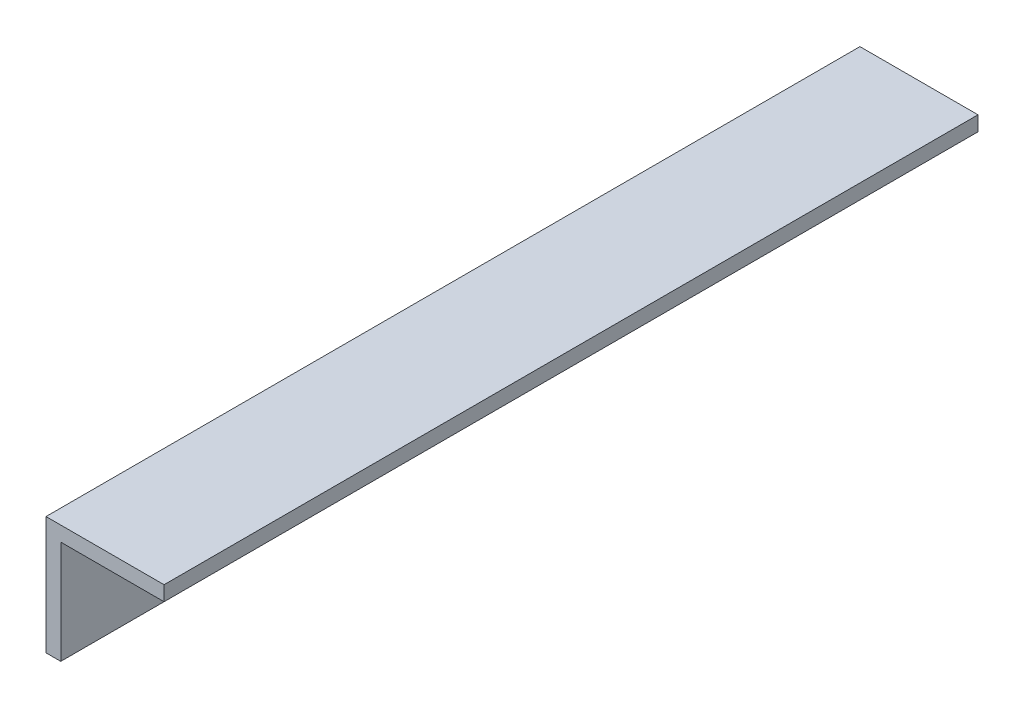
ISO-10303-21;
HEADER;
FILE_DESCRIPTION(('STEP AP214'),'2;1');
FILE_NAME('part.step','',(''),(''),'','','');
FILE_SCHEMA(('AUTOMOTIVE_DESIGN { 1 0 10303 214 1 1 1 1 }'));
ENDSEC;
DATA;
#1=APPLICATION_CONTEXT('core data for automotive mechanical design processes');
#2=APPLICATION_PROTOCOL_DEFINITION('international standard','automotive_design',2000,#1);
#3=PRODUCT_CONTEXT('',#1,'mechanical');
#4=PRODUCT('Part','Part','',(#3));
#5=PRODUCT_RELATED_PRODUCT_CATEGORY('part','',(#4));
#6=PRODUCT_DEFINITION_FORMATION('','',#4);
#7=PRODUCT_DEFINITION_CONTEXT('part definition',#1,'design');
#8=PRODUCT_DEFINITION('design','',#6,#7);
#9=PRODUCT_DEFINITION_SHAPE('','',#8);
#10=(LENGTH_UNIT() NAMED_UNIT(*) SI_UNIT(.MILLI.,.METRE.));
#11=(NAMED_UNIT(*) PLANE_ANGLE_UNIT() SI_UNIT($,.RADIAN.));
#12=(NAMED_UNIT(*) SI_UNIT($,.STERADIAN.) SOLID_ANGLE_UNIT());
#13=UNCERTAINTY_MEASURE_WITH_UNIT(LENGTH_MEASURE(1.E-05),#10,'distance_accuracy_value','');
#14=(GEOMETRIC_REPRESENTATION_CONTEXT(3) GLOBAL_UNCERTAINTY_ASSIGNED_CONTEXT((#13)) GLOBAL_UNIT_ASSIGNED_CONTEXT((#10,
#11,#12)) REPRESENTATION_CONTEXT('',''));
#15=CARTESIAN_POINT('',(0.,0.,0.));
#16=DIRECTION('',(0.,0.,1.));
#17=DIRECTION('',(1.,0.,0.));
#18=AXIS2_PLACEMENT_3D('',#15,#16,#17);
#19=CARTESIAN_POINT('',(3.175,0.,175.1));
#20=DIRECTION('',(0.,1.,0.));
#21=DIRECTION('',(-1.,0.,0.));
#22=AXIS2_PLACEMENT_3D('',#19,#20,#21);
#23=PLANE('',#22);
#24=DIRECTION('',(1.,0.,0.));
#25=VECTOR('',#24,1.);
#26=CARTESIAN_POINT('',(3.175,0.,0.));
#27=LINE('',#26,#25);
#28=CARTESIAN_POINT('',(0.,0.,0.));
#29=VERTEX_POINT('',#28);
#30=CARTESIAN_POINT('',(3.175,0.,0.));
#31=VERTEX_POINT('',#30);
#32=EDGE_CURVE('E117',#29,#31,#27,.T.);
#33=ORIENTED_EDGE('',*,*,#32,.T.);
#34=DIRECTION('',(0.,0.,-1.));
#35=VECTOR('',#34,1.);
#36=CARTESIAN_POINT('',(3.175,0.,175.1));
#37=LINE('',#36,#35);
#38=CARTESIAN_POINT('',(3.175,0.,175.1));
#39=VERTEX_POINT('',#38);
#40=EDGE_CURVE('E11',#39,#31,#37,.T.);
#41=ORIENTED_EDGE('',*,*,#40,.F.);
#42=DIRECTION('',(1.,0.,0.));
#43=VECTOR('',#42,1.);
#44=CARTESIAN_POINT('',(3.175,0.,175.1));
#45=LINE('',#44,#43);
#46=CARTESIAN_POINT('',(0.,0.,175.1));
#47=VERTEX_POINT('',#46);
#48=EDGE_CURVE('E127',#47,#39,#45,.T.);
#49=ORIENTED_EDGE('',*,*,#48,.F.);
#50=DIRECTION('',(0.,0.,-1.));
#51=VECTOR('',#50,1.);
#52=CARTESIAN_POINT('',(0.,0.,175.1));
#53=LINE('',#52,#51);
#54=EDGE_CURVE('E113',#47,#29,#53,.T.);
#55=ORIENTED_EDGE('',*,*,#54,.T.);
#56=EDGE_LOOP('',(#33,#41,#49,#55));
#57=FACE_BOUND('',#56,.T.);
#58=ADVANCED_FACE('F33',(#57),#23,.F.);
#59=CARTESIAN_POINT('',(3.175,22.225,175.1));
#60=DIRECTION('',(-1.,0.,0.));
#61=DIRECTION('',(0.,-1.,0.));
#62=AXIS2_PLACEMENT_3D('',#59,#60,#61);
#63=PLANE('',#62);
#64=DIRECTION('',(0.,1.,0.));
#65=VECTOR('',#64,1.);
#66=CARTESIAN_POINT('',(3.175,22.225,0.));
#67=LINE('',#66,#65);
#68=CARTESIAN_POINT('',(3.175,22.225,0.));
#69=VERTEX_POINT('',#68);
#70=EDGE_CURVE('E120',#31,#69,#67,.T.);
#71=ORIENTED_EDGE('',*,*,#70,.T.);
#72=DIRECTION('',(0.,0.,-1.));
#73=VECTOR('',#72,1.);
#74=CARTESIAN_POINT('',(3.175,22.225,175.1));
#75=LINE('',#74,#73);
#76=CARTESIAN_POINT('',(3.175,22.225,175.1));
#77=VERTEX_POINT('',#76);
#78=EDGE_CURVE('E41',#77,#69,#75,.T.);
#79=ORIENTED_EDGE('',*,*,#78,.F.);
#80=DIRECTION('',(0.,1.,0.));
#81=VECTOR('',#80,1.);
#82=CARTESIAN_POINT('',(3.175,22.225,175.1));
#83=LINE('',#82,#81);
#84=EDGE_CURVE('E86',#39,#77,#83,.T.);
#85=ORIENTED_EDGE('',*,*,#84,.F.);
#86=ORIENTED_EDGE('',*,*,#40,.T.);
#87=EDGE_LOOP('',(#71,#79,#85,#86));
#88=FACE_BOUND('',#87,.T.);
#89=ADVANCED_FACE('F151',(#88),#63,.F.);
#90=CARTESIAN_POINT('',(25.4,22.225,175.1));
#91=DIRECTION('',(0.,1.,0.));
#92=DIRECTION('',(-1.,0.,0.));
#93=AXIS2_PLACEMENT_3D('',#90,#91,#92);
#94=PLANE('',#93);
#95=DIRECTION('',(1.,0.,0.));
#96=VECTOR('',#95,1.);
#97=CARTESIAN_POINT('',(25.4,22.225,0.));
#98=LINE('',#97,#96);
#99=CARTESIAN_POINT('',(25.4,22.225,0.));
#100=VERTEX_POINT('',#99);
#101=EDGE_CURVE('E122',#69,#100,#98,.T.);
#102=ORIENTED_EDGE('',*,*,#101,.T.);
#103=DIRECTION('',(0.,0.,-1.));
#104=VECTOR('',#103,1.);
#105=CARTESIAN_POINT('',(25.4,22.225,175.1));
#106=LINE('',#105,#104);
#107=CARTESIAN_POINT('',(25.4,22.225,175.1));
#108=VERTEX_POINT('',#107);
#109=EDGE_CURVE('E108',#108,#100,#106,.T.);
#110=ORIENTED_EDGE('',*,*,#109,.F.);
#111=DIRECTION('',(1.,0.,0.));
#112=VECTOR('',#111,1.);
#113=CARTESIAN_POINT('',(25.4,22.225,175.1));
#114=LINE('',#113,#112);
#115=EDGE_CURVE('E99',#77,#108,#114,.T.);
#116=ORIENTED_EDGE('',*,*,#115,.F.);
#117=ORIENTED_EDGE('',*,*,#78,.T.);
#118=EDGE_LOOP('',(#102,#110,#116,#117));
#119=FACE_BOUND('',#118,.T.);
#120=ADVANCED_FACE('F133',(#119),#94,.F.);
#121=CARTESIAN_POINT('',(25.4,25.4,175.1));
#122=DIRECTION('',(-1.,0.,0.));
#123=DIRECTION('',(0.,0.,1.));
#124=AXIS2_PLACEMENT_3D('',#121,#122,#123);
#125=PLANE('',#124);
#126=DIRECTION('',(0.,1.,0.));
#127=VECTOR('',#126,1.);
#128=CARTESIAN_POINT('',(25.4,25.4,0.));
#129=LINE('',#128,#127);
#130=CARTESIAN_POINT('',(25.4,25.4,0.));
#131=VERTEX_POINT('',#130);
#132=EDGE_CURVE('E107',#100,#131,#129,.T.);
#133=ORIENTED_EDGE('',*,*,#132,.T.);
#134=DIRECTION('',(0.,0.,-1.));
#135=VECTOR('',#134,1.);
#136=CARTESIAN_POINT('',(25.4,25.4,175.1));
#137=LINE('',#136,#135);
#138=CARTESIAN_POINT('',(25.4,25.4,175.1));
#139=VERTEX_POINT('',#138);
#140=EDGE_CURVE('E104',#139,#131,#137,.T.);
#141=ORIENTED_EDGE('',*,*,#140,.F.);
#142=DIRECTION('',(0.,1.,0.));
#143=VECTOR('',#142,1.);
#144=CARTESIAN_POINT('',(25.4,25.4,175.1));
#145=LINE('',#144,#143);
#146=EDGE_CURVE('E93',#108,#139,#145,.T.);
#147=ORIENTED_EDGE('',*,*,#146,.F.);
#148=ORIENTED_EDGE('',*,*,#109,.T.);
#149=EDGE_LOOP('',(#133,#141,#147,#148));
#150=FACE_BOUND('',#149,.T.);
#151=ADVANCED_FACE('F105',(#150),#125,.F.);
#152=CARTESIAN_POINT('',(0.,25.4,175.1));
#153=DIRECTION('',(0.,-1.,0.));
#154=DIRECTION('',(0.,0.,-1.));
#155=AXIS2_PLACEMENT_3D('',#152,#153,#154);
#156=PLANE('',#155);
#157=DIRECTION('',(-1.,0.,0.));
#158=VECTOR('',#157,1.);
#159=CARTESIAN_POINT('',(0.,25.4,0.));
#160=LINE('',#159,#158);
#161=CARTESIAN_POINT('',(0.,25.4,0.));
#162=VERTEX_POINT('',#161);
#163=EDGE_CURVE('E72',#131,#162,#160,.T.);
#164=ORIENTED_EDGE('',*,*,#163,.T.);
#165=DIRECTION('',(0.,0.,-1.));
#166=VECTOR('',#165,1.);
#167=CARTESIAN_POINT('',(0.,25.4,175.1));
#168=LINE('',#167,#166);
#169=CARTESIAN_POINT('',(0.,25.4,175.1));
#170=VERTEX_POINT('',#169);
#171=EDGE_CURVE('E109',#170,#162,#168,.T.);
#172=ORIENTED_EDGE('',*,*,#171,.F.);
#173=DIRECTION('',(-1.,0.,0.));
#174=VECTOR('',#173,1.);
#175=CARTESIAN_POINT('',(0.,25.4,175.1));
#176=LINE('',#175,#174);
#177=EDGE_CURVE('E97',#139,#170,#176,.T.);
#178=ORIENTED_EDGE('',*,*,#177,.F.);
#179=ORIENTED_EDGE('',*,*,#140,.T.);
#180=EDGE_LOOP('',(#164,#172,#178,#179));
#181=FACE_BOUND('',#180,.T.);
#182=ADVANCED_FACE('F111',(#181),#156,.F.);
#183=CARTESIAN_POINT('',(0.,0.,175.1));
#184=DIRECTION('',(1.,0.,0.));
#185=DIRECTION('',(0.,0.,-1.));
#186=AXIS2_PLACEMENT_3D('',#183,#184,#185);
#187=PLANE('',#186);
#188=DIRECTION('',(0.,-1.,0.));
#189=VECTOR('',#188,1.);
#190=CARTESIAN_POINT('',(0.,0.,0.));
#191=LINE('',#190,#189);
#192=EDGE_CURVE('E78',#162,#29,#191,.T.);
#193=ORIENTED_EDGE('',*,*,#192,.T.);
#194=ORIENTED_EDGE('',*,*,#54,.F.);
#195=DIRECTION('',(0.,-1.,0.));
#196=VECTOR('',#195,1.);
#197=CARTESIAN_POINT('',(0.,0.,175.1));
#198=LINE('',#197,#196);
#199=EDGE_CURVE('E49',#170,#47,#198,.T.);
#200=ORIENTED_EDGE('',*,*,#199,.F.);
#201=ORIENTED_EDGE('',*,*,#171,.T.);
#202=EDGE_LOOP('',(#193,#194,#200,#201));
#203=FACE_BOUND('',#202,.T.);
#204=ADVANCED_FACE('F140',(#203),#187,.F.);
#205=CARTESIAN_POINT('',(0.,0.,175.1));
#206=DIRECTION('',(0.,0.,-1.));
#207=DIRECTION('',(-1.,0.,0.));
#208=AXIS2_PLACEMENT_3D('',#205,#206,#207);
#209=PLANE('',#208);
#210=ORIENTED_EDGE('',*,*,#48,.T.);
#211=ORIENTED_EDGE('',*,*,#84,.T.);
#212=ORIENTED_EDGE('',*,*,#115,.T.);
#213=ORIENTED_EDGE('',*,*,#146,.T.);
#214=ORIENTED_EDGE('',*,*,#177,.T.);
#215=ORIENTED_EDGE('',*,*,#199,.T.);
#216=EDGE_LOOP('',(#210,#211,#212,#213,#214,#215));
#217=FACE_BOUND('',#216,.T.);
#218=ADVANCED_FACE('F95',(#217),#209,.F.);
#219=CARTESIAN_POINT('',(0.,0.,0.));
#220=DIRECTION('',(0.,0.,-1.));
#221=DIRECTION('',(-1.,0.,0.));
#222=AXIS2_PLACEMENT_3D('',#219,#220,#221);
#223=PLANE('',#222);
#224=ORIENTED_EDGE('',*,*,#32,.F.);
#225=ORIENTED_EDGE('',*,*,#192,.F.);
#226=ORIENTED_EDGE('',*,*,#163,.F.);
#227=ORIENTED_EDGE('',*,*,#132,.F.);
#228=ORIENTED_EDGE('',*,*,#101,.F.);
#229=ORIENTED_EDGE('',*,*,#70,.F.);
#230=EDGE_LOOP('',(#224,#225,#226,#227,#228,#229));
#231=FACE_BOUND('',#230,.T.);
#232=ADVANCED_FACE('F136',(#231),#223,.T.);
#233=CLOSED_SHELL('',(#58,#89,#120,#151,#182,#204,#218,#232));
#234=MANIFOLD_SOLID_BREP('B2',#233);
#235=ADVANCED_BREP_SHAPE_REPRESENTATION('',(#18,#234),#14);
#236=SHAPE_DEFINITION_REPRESENTATION(#9,#235);
ENDSEC;
END-ISO-10303-21;
